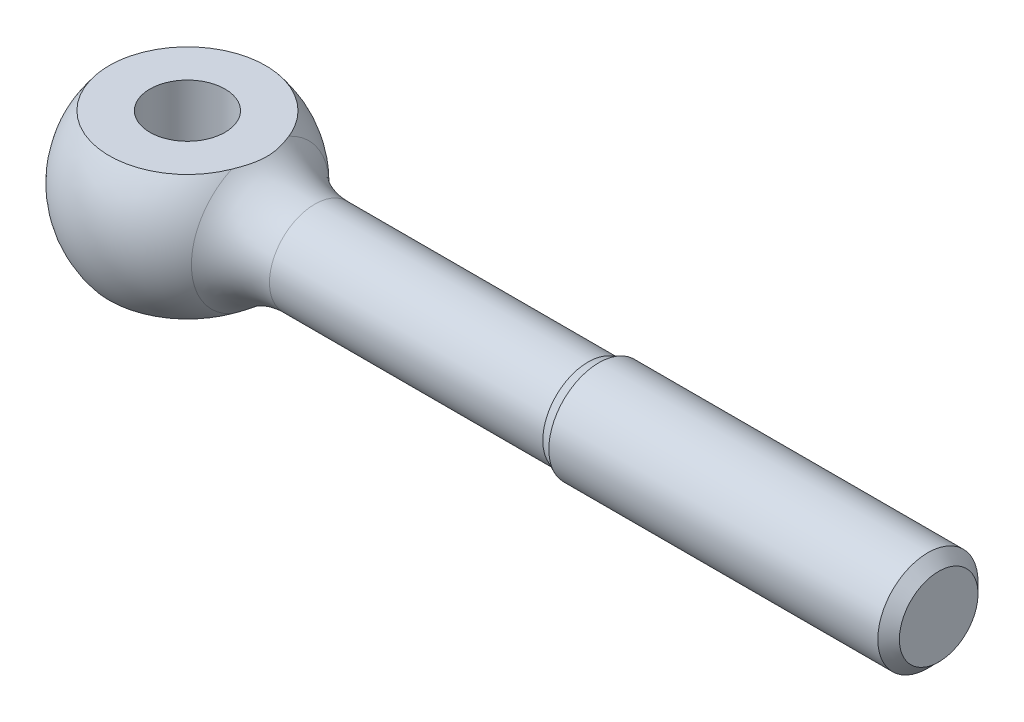
ISO-10303-21;
HEADER;
FILE_DESCRIPTION(('STEP AP214'),'2;1');
FILE_NAME('part.step','',(''),(''),'','','');
FILE_SCHEMA(('AUTOMOTIVE_DESIGN { 1 0 10303 214 1 1 1 1 }'));
ENDSEC;
DATA;
#1=APPLICATION_CONTEXT('core data for automotive mechanical design processes');
#2=APPLICATION_PROTOCOL_DEFINITION('international standard','automotive_design',2000,#1);
#3=PRODUCT_CONTEXT('',#1,'mechanical');
#4=PRODUCT('Part','Part','',(#3));
#5=PRODUCT_RELATED_PRODUCT_CATEGORY('part','',(#4));
#6=PRODUCT_DEFINITION_FORMATION('','',#4);
#7=PRODUCT_DEFINITION_CONTEXT('part definition',#1,'design');
#8=PRODUCT_DEFINITION('design','',#6,#7);
#9=PRODUCT_DEFINITION_SHAPE('','',#8);
#10=(LENGTH_UNIT() NAMED_UNIT(*) SI_UNIT(.MILLI.,.METRE.));
#11=(NAMED_UNIT(*) PLANE_ANGLE_UNIT() SI_UNIT($,.RADIAN.));
#12=(NAMED_UNIT(*) SI_UNIT($,.STERADIAN.) SOLID_ANGLE_UNIT());
#13=UNCERTAINTY_MEASURE_WITH_UNIT(LENGTH_MEASURE(1.E-05),#10,'distance_accuracy_value','');
#14=(GEOMETRIC_REPRESENTATION_CONTEXT(3) GLOBAL_UNCERTAINTY_ASSIGNED_CONTEXT((#13)) GLOBAL_UNIT_ASSIGNED_CONTEXT((#10,
#11,#12)) REPRESENTATION_CONTEXT('',''));
#15=CARTESIAN_POINT('',(0.,0.,0.));
#16=DIRECTION('',(0.,0.,1.));
#17=DIRECTION('',(1.,0.,0.));
#18=AXIS2_PLACEMENT_3D('',#15,#16,#17);
#19=CARTESIAN_POINT('',(-16.430415,32.7845575287547,0.));
#20=DIRECTION('',(0.,-1.,0.));
#21=DIRECTION('',(0.,0.,-1.));
#22=AXIS2_PLACEMENT_3D('',#19,#20,#21);
#23=CYLINDRICAL_SURFACE('',#22,1.5);
#24=CARTESIAN_POINT('',(-16.430415,2.50000000000001,0.));
#25=DIRECTION('',(0.,-1.,0.));
#26=DIRECTION('',(0.,0.,-1.));
#27=AXIS2_PLACEMENT_3D('',#24,#25,#26);
#28=CIRCLE('',#27,1.5);
#29=CARTESIAN_POINT('',(-16.430415,2.50000000000001,-1.5));
#30=VERTEX_POINT('',#29);
#31=EDGE_CURVE('E62',#30,#30,#28,.F.);
#32=ORIENTED_EDGE('',*,*,#31,.T.);
#33=EDGE_LOOP('',(#32));
#34=FACE_BOUND('',#33,.T.);
#35=CARTESIAN_POINT('',(-16.430415,-2.49999999999999,0.));
#36=DIRECTION('',(0.,-1.,0.));
#37=DIRECTION('',(0.,0.,-1.));
#38=AXIS2_PLACEMENT_3D('',#35,#36,#37);
#39=CIRCLE('',#38,1.5);
#40=CARTESIAN_POINT('',(-16.430415,-2.49999999999999,-1.5));
#41=VERTEX_POINT('',#40);
#42=EDGE_CURVE('E211',#41,#41,#39,.T.);
#43=ORIENTED_EDGE('',*,*,#42,.T.);
#44=EDGE_LOOP('',(#43));
#45=FACE_BOUND('',#44,.T.);
#46=ADVANCED_FACE('F17',(#34,#45),#23,.F.);
#47=CARTESIAN_POINT('',(-12.430415,-2.49999999999999,-3.1224989991992));
#48=DIRECTION('',(0.,1.,0.));
#49=DIRECTION('',(0.,0.,1.));
#50=AXIS2_PLACEMENT_3D('',#47,#48,#49);
#51=PLANE('',#50);
#52=ORIENTED_EDGE('',*,*,#42,.F.);
#53=EDGE_LOOP('',(#52));
#54=FACE_BOUND('',#53,.T.);
#55=CARTESIAN_POINT('',(-13.524595940223,-2.49999999999999,-1.1428978921307));
#56=CARTESIAN_POINT('',(-13.5567368660586,-2.49999999999999,-1.22463926203189));
#57=CARTESIAN_POINT('',(-13.5923408409082,-2.49999999999999,-1.30501429838637));
#58=CARTESIAN_POINT('',(-13.6701871202625,-2.49999999999999,-1.46247812074654));
#59=CARTESIAN_POINT('',(-13.7124291118369,-2.49999999999999,-1.5395670614482));
#60=CARTESIAN_POINT('',(-13.8032241577669,-2.49999999999999,-1.6898424399874));
#61=CARTESIAN_POINT('',(-13.8517712581273,-2.49999999999999,-1.76303246881264));
#62=CARTESIAN_POINT('',(-13.9548352861876,-2.49999999999999,-1.90504949057192));
#63=CARTESIAN_POINT('',(-14.009352131782,-2.49999999999999,-1.97387654349199));
#64=CARTESIAN_POINT('',(-14.1813573101929,-2.49999999999999,-2.17312248058257));
#65=CARTESIAN_POINT('',(-14.3073456944323,-2.49999999999999,-2.29638114868705));
#66=CARTESIAN_POINT('',(-14.5781922836227,-2.49999999999999,-2.51995079134315));
#67=CARTESIAN_POINT('',(-14.7230540827756,-2.49999999999999,-2.62025738490982));
#68=CARTESIAN_POINT('',(-15.0276458685913,-2.49999999999999,-2.79519191197083));
#69=CARTESIAN_POINT('',(-15.1873843121425,-2.5,-2.86980512501155));
#70=CARTESIAN_POINT('',(-15.5169829326932,-2.49999999999998,-2.99105390113957));
#71=CARTESIAN_POINT('',(-15.6868293243354,-2.49999999999995,-3.03772665021387));
#72=CARTESIAN_POINT('',(-15.953384925106,-2.49999999999997,-3.08733559515243));
#73=CARTESIAN_POINT('',(-16.0482991702281,-2.49999999999998,-3.1005080376549));
#74=CARTESIAN_POINT('',(-16.2389319447034,-2.5,-3.11809183040555));
#75=CARTESIAN_POINT('',(-16.3346504429088,-2.49999999999999,-3.12250351839184));
#76=CARTESIAN_POINT('',(-16.6057683715715,-2.49999999999999,-3.12249072415791));
#77=CARTESIAN_POINT('',(-16.7812761732812,-2.49999999999999,-3.10767541517859));
#78=CARTESIAN_POINT('',(-17.1274906802518,-2.49999999999999,-3.04877068055413));
#79=CARTESIAN_POINT('',(-17.2981899692712,-2.49999999999998,-3.00463836737204));
#80=CARTESIAN_POINT('',(-17.629673558849,-2.49999999999998,-2.8883551353376));
#81=CARTESIAN_POINT('',(-17.7904635272921,-2.49999999999999,-2.81622040879443));
#82=CARTESIAN_POINT('',(-18.0975948561608,-2.49999999999999,-2.64600334290594));
#83=CARTESIAN_POINT('',(-18.243940671218,-2.49999999999999,-2.54792903797721));
#84=CARTESIAN_POINT('',(-18.5181123873996,-2.49999999999998,-2.32859212437852));
#85=CARTESIAN_POINT('',(-18.6459358953709,-2.49999999999999,-2.20732652399153));
#86=CARTESIAN_POINT('',(-18.8794160536925,-2.49999999999999,-1.94505050451286));
#87=CARTESIAN_POINT('',(-18.9850715668696,-2.49999999999999,-1.80403907311862));
#88=CARTESIAN_POINT('',(-19.1712063819853,-2.49999999999999,-1.50628281772447));
#89=CARTESIAN_POINT('',(-19.2516862827807,-2.49999999999999,-1.34953836808591));
#90=CARTESIAN_POINT('',(-19.3851883129915,-2.49999999999999,-1.02476338772591));
#91=CARTESIAN_POINT('',(-19.4382105441341,-2.49999999999999,-0.856732898820413));
#92=CARTESIAN_POINT('',(-19.5152926899075,-2.49999999999999,-0.514154719911592));
#93=CARTESIAN_POINT('',(-19.5393525236232,-2.49999999999999,-0.339607011701875));
#94=CARTESIAN_POINT('',(-19.5578265879258,-2.49999999999999,0.0110499255171217));
#95=CARTESIAN_POINT('',(-19.5522408743253,-2.49999999999999,0.187159151585962));
#96=CARTESIAN_POINT('',(-19.5115825347528,-2.49999999999999,0.535940265461711));
#97=CARTESIAN_POINT('',(-19.4765099039244,-2.49999999999999,0.708612152702497));
#98=CARTESIAN_POINT('',(-19.3778732527818,-2.49999999999999,1.04561718171691));
#99=CARTESIAN_POINT('',(-19.3143091882126,-2.49999999999999,1.20995031053776));
#100=CARTESIAN_POINT('',(-19.1604940410886,-2.49999999999999,1.52561262617009));
#101=CARTESIAN_POINT('',(-19.0702429528602,-2.5,1.67694181021703));
#102=CARTESIAN_POINT('',(-18.8656159346688,-2.49999999999999,1.96230011506724));
#103=CARTESIAN_POINT('',(-18.7512400524363,-2.49999999999997,2.0963292700974));
#104=CARTESIAN_POINT('',(-18.5016103536625,-2.50000000000001,2.34328295986282));
#105=CARTESIAN_POINT('',(-18.3663565746603,-2.50000000000006,2.45620753254402));
#106=CARTESIAN_POINT('',(-18.078809563764,-2.49999999999992,2.65774734081834));
#107=CARTESIAN_POINT('',(-17.9265162368875,-2.49999999999974,2.74636244089557));
#108=CARTESIAN_POINT('',(-17.6092130015527,-2.49999999999974,2.89676737013976));
#109=CARTESIAN_POINT('',(-17.4442030193099,-2.49999999999993,2.9585570436468));
#110=CARTESIAN_POINT('',(-17.1061543897262,-2.50000000000005,3.05355549140488));
#111=CARTESIAN_POINT('',(-16.9331158803634,-2.49999999999999,3.08676475664652));
#112=CARTESIAN_POINT('',(-16.5839219982289,-2.49999999999996,3.1236612529022));
#113=CARTESIAN_POINT('',(-16.4077666691203,-2.49999999999998,3.12734889715296));
#114=CARTESIAN_POINT('',(-16.0573291073801,-2.5,3.10509800790834));
#115=CARTESIAN_POINT('',(-15.8830469597271,-2.49999999999999,3.0791581360097));
#116=CARTESIAN_POINT('',(-15.5413086394673,-2.49999999999998,2.99838588241138));
#117=CARTESIAN_POINT('',(-15.373852583804,-2.49999999999999,2.94355300594586));
#118=CARTESIAN_POINT('',(-15.050536008266,-2.49999999999999,2.80655597267397));
#119=CARTESIAN_POINT('',(-14.8946745685072,-2.49999999999998,2.72439398691786));
#120=CARTESIAN_POINT('',(-14.5989472876592,-2.49999999999999,2.53506504576685));
#121=CARTESIAN_POINT('',(-14.4590826397929,-2.5,2.42789622688757));
#122=CARTESIAN_POINT('',(-14.1993354219764,-2.49999999999999,2.19159875654685));
#123=CARTESIAN_POINT('',(-14.0794514609099,-2.49999999999997,2.06247163515502));
#124=CARTESIAN_POINT('',(-13.8784652941468,-2.49999999999997,1.80561116952173));
#125=CARTESIAN_POINT('',(-13.7942724901493,-2.49999999999999,1.68029059166461));
#126=CARTESIAN_POINT('',(-13.6822358743962,-2.49999999999999,1.48431331758132));
#127=CARTESIAN_POINT('',(-13.6472637072771,-2.49999999999999,1.41764959643221));
#128=CARTESIAN_POINT('',(-13.5822172842706,-2.49999999999999,1.28196303245504));
#129=CARTESIAN_POINT('',(-13.5521436806339,-2.49999999999999,1.21293987694294));
#130=CARTESIAN_POINT('',(-13.524595940223,-2.49999999999999,1.1428978921307));
#131=B_SPLINE_CURVE_WITH_KNOTS('',3,(#55,#56,#57,#58,#59,#60,#61,#62,#63,#64,#65,#66,#67,#68,
#69,#70,#71,#72,#73,#74,#75,#76,#77,#78,#79,#80,#81,#82,#83,#84,#85,#86,#87,#88,#89,#90,#91,#92,
#93,#94,#95,#96,#97,#98,#99,#100,#101,#102,#103,#104,#105,#106,#107,#108,#109,#110,#111,#112,
#113,#114,#115,#116,#117,#118,#119,#120,#121,#122,#123,#124,#125,#126,#127,#128,#129,#130),
.UNSPECIFIED.,.F.,.F.,(4,2,2,2,2,2,2,2,2,2,2,2,2,2,2,2,2,2,2,2,2,2,2,2,2,2,2,2,2,2,2,2,2,2,2,2,
2,4),(0.,0.263414259689397,0.526816105185968,0.789971001274575,1.05312227849276,
1.57916510543364,2.10530825737322,2.63175235180025,3.15749423461266,3.44460646530042,
3.73170762723536,4.25741524032911,4.78389360413193,5.31006798583657,5.8360795829562,
6.36215908230531,6.888265561868,7.41435952588778,7.94045154078226,8.46654502546847,
8.99263751969653,9.51873010057026,10.0448234986108,10.5709170084954,11.0970094775251,
11.6231010006337,12.1491954564391,12.6752929649725,13.2013814353533,13.7274625416582,
14.2535674142657,14.7796812962228,15.305753393174,15.8318647050223,16.3579393720838,
16.8092076713177,17.034875219021,17.2605727901528),.UNSPECIFIED.);
#132=CARTESIAN_POINT('',(-13.524595940223,-2.49999999999999,-1.14289789213067));
#133=VERTEX_POINT('',#132);
#134=CARTESIAN_POINT('',(-13.524595940223,-2.49999999999999,1.14289789213069));
#135=VERTEX_POINT('',#134);
#136=EDGE_CURVE('E55',#133,#135,#131,.T.);
#137=ORIENTED_EDGE('',*,*,#136,.F.);
#138=CARTESIAN_POINT('',(-13.524595940223,-2.49999999999999,-1.14289789213068));
#139=CARTESIAN_POINT('',(-13.499200790924,-2.49999999999999,-1.07825053070375));
#140=CARTESIAN_POINT('',(-13.4744664858845,-2.49999999999999,-1.01329951319512));
#141=CARTESIAN_POINT('',(-13.4271247212185,-2.49999999999999,-0.881760918662736));
#142=CARTESIAN_POINT('',(-13.4045460492588,-2.49999999999999,-0.815163065115482));
#143=CARTESIAN_POINT('',(-13.3629010862458,-2.49999999999999,-0.680581259809072));
#144=CARTESIAN_POINT('',(-13.3438479362499,-2.49999999999999,-0.612593131133472));
#145=CARTESIAN_POINT('',(-13.3115670485199,-2.49999999999999,-0.478962020680978));
#146=CARTESIAN_POINT('',(-13.2980877030017,-2.49999999999999,-0.413381184760442));
#147=CARTESIAN_POINT('',(-13.2767364786791,-2.49999999999999,-0.281567599060676));
#148=CARTESIAN_POINT('',(-13.2688414238244,-2.49999999999999,-0.21533871409973));
#149=CARTESIAN_POINT('',(-13.2593638888557,-2.49999999999999,-0.0826316351900437));
#150=CARTESIAN_POINT('',(-13.2577609382026,-2.49999999999999,-0.0161549551731257));
#151=CARTESIAN_POINT('',(-13.2608491277909,-2.49999999999999,0.111348957452643));
#152=CARTESIAN_POINT('',(-13.2650496169922,-2.49999999999999,0.172388930874359));
#153=CARTESIAN_POINT('',(-13.278536344856,-2.49999999999999,0.294083249894014));
#154=CARTESIAN_POINT('',(-13.2878383640093,-2.49999999999999,0.354735805133442));
#155=CARTESIAN_POINT('',(-13.3108517063395,-2.49999999999999,0.475401330990348));
#156=CARTESIAN_POINT('',(-13.3245785617971,-2.49999999999999,0.535411267575846));
#157=CARTESIAN_POINT('',(-13.3563351620112,-2.49999999999999,0.657531680185444));
#158=CARTESIAN_POINT('',(-13.3745483542819,-2.49999999999999,0.71959360743062));
#159=CARTESIAN_POINT('',(-13.4137702392131,-2.49999999999999,0.842570730772874));
#160=CARTESIAN_POINT('',(-13.434769029535,-2.49999999999999,0.903489154491351));
#161=CARTESIAN_POINT('',(-13.4785355386727,-2.49999999999999,1.02398349010867));
#162=CARTESIAN_POINT('',(-13.5012828477354,-2.49999999999999,1.08356676551448));
#163=CARTESIAN_POINT('',(-13.524595940223,-2.49999999999999,1.14289789213068));
#164=B_SPLINE_CURVE_WITH_KNOTS('',3,(#138,#139,#140,#141,#142,#143,#144,#145,#146,#147,#148,
#149,#150,#151,#152,#153,#154,#155,#156,#157,#158,#159,#160,#161,#162,#163),.UNSPECIFIED.,.F.,
.F.,(4,2,2,2,2,2,2,2,2,2,2,2,4),(0.,0.208429010934663,0.419336452697772,0.631014857291546,
0.83167463411297,1.03149666256139,1.23066805467507,1.413992067586,1.59788637896195,
1.78243336611685,1.97637342164557,2.16964165687939,2.3609225633829),.UNSPECIFIED.);
#165=EDGE_CURVE('E49',#133,#135,#164,.T.);
#166=ORIENTED_EDGE('',*,*,#165,.T.);
#167=EDGE_LOOP('',(#137,#166));
#168=FACE_BOUND('',#167,.T.);
#169=ADVANCED_FACE('F54',(#54,#168),#51,.F.);
#170=CARTESIAN_POINT('',(-12.430415,2.50000000000001,3.1224989991992));
#171=DIRECTION('',(0.,-1.,0.));
#172=DIRECTION('',(0.,0.,-1.));
#173=AXIS2_PLACEMENT_3D('',#170,#171,#172);
#174=PLANE('',#173);
#175=ORIENTED_EDGE('',*,*,#31,.F.);
#176=EDGE_LOOP('',(#175));
#177=FACE_BOUND('',#176,.T.);
#178=CARTESIAN_POINT('',(-13.524595940223,2.50000000000001,1.14289789213065));
#179=CARTESIAN_POINT('',(-13.5567368660586,2.50000000000001,1.22463926203184));
#180=CARTESIAN_POINT('',(-13.5923408409082,2.50000000000001,1.30501429838632));
#181=CARTESIAN_POINT('',(-13.6701871202625,2.50000000000001,1.46247812074649));
#182=CARTESIAN_POINT('',(-13.7124291118369,2.50000000000001,1.53956706144815));
#183=CARTESIAN_POINT('',(-13.8032241577668,2.50000000000001,1.68984243998735));
#184=CARTESIAN_POINT('',(-13.8517712581273,2.50000000000001,1.76303246881259));
#185=CARTESIAN_POINT('',(-13.9548352861876,2.50000000000001,1.90504949057187));
#186=CARTESIAN_POINT('',(-14.009352131782,2.50000000000001,1.97387654349194));
#187=CARTESIAN_POINT('',(-14.1813573101929,2.50000000000001,2.17312248058253));
#188=CARTESIAN_POINT('',(-14.3073456944323,2.50000000000001,2.296381148687));
#189=CARTESIAN_POINT('',(-14.5781922836227,2.50000000000001,2.51995079134311));
#190=CARTESIAN_POINT('',(-14.7230540827756,2.50000000000001,2.62025738490978));
#191=CARTESIAN_POINT('',(-15.0276458685913,2.50000000000001,2.7951919119708));
#192=CARTESIAN_POINT('',(-15.1873843121424,2.50000000000002,2.86980512501152));
#193=CARTESIAN_POINT('',(-15.5169829326932,2.5,2.99105390113954));
#194=CARTESIAN_POINT('',(-15.6868293243354,2.49999999999997,3.03772665021384));
#195=CARTESIAN_POINT('',(-15.953384925106,2.49999999999999,3.0873355951524));
#196=CARTESIAN_POINT('',(-16.048299170228,2.5,3.10050803765488));
#197=CARTESIAN_POINT('',(-16.2389319447034,2.50000000000002,3.11809183040553));
#198=CARTESIAN_POINT('',(-16.3346504429088,2.50000000000001,3.12250351839182));
#199=CARTESIAN_POINT('',(-16.6057683715715,2.50000000000001,3.12249072415789));
#200=CARTESIAN_POINT('',(-16.7812761732812,2.50000000000001,3.10767541517858));
#201=CARTESIAN_POINT('',(-17.1274906802518,2.50000000000001,3.04877068055411));
#202=CARTESIAN_POINT('',(-17.2981899692712,2.5,3.00463836737202));
#203=CARTESIAN_POINT('',(-17.629673558849,2.5,2.88835513533758));
#204=CARTESIAN_POINT('',(-17.7904635272921,2.50000000000001,2.81622040879441));
#205=CARTESIAN_POINT('',(-18.0975948561607,2.50000000000001,2.64600334290593));
#206=CARTESIAN_POINT('',(-18.243940671218,2.50000000000001,2.5479290379772));
#207=CARTESIAN_POINT('',(-18.5181123873996,2.50000000000001,2.32859212437851));
#208=CARTESIAN_POINT('',(-18.6459358953709,2.50000000000001,2.20732652399151));
#209=CARTESIAN_POINT('',(-18.8794160536924,2.50000000000001,1.94505050451285));
#210=CARTESIAN_POINT('',(-18.9850715668696,2.50000000000001,1.80403907311861));
#211=CARTESIAN_POINT('',(-19.1712063819852,2.50000000000001,1.50628281772446));
#212=CARTESIAN_POINT('',(-19.2516862827807,2.50000000000001,1.3495383680859));
#213=CARTESIAN_POINT('',(-19.3851883129915,2.50000000000001,1.0247633877259));
#214=CARTESIAN_POINT('',(-19.4382105441341,2.50000000000001,0.856732898820406));
#215=CARTESIAN_POINT('',(-19.5152926899075,2.50000000000001,0.514154719911587));
#216=CARTESIAN_POINT('',(-19.5393525236232,2.50000000000001,0.339607011701872));
#217=CARTESIAN_POINT('',(-19.5578265879257,2.50000000000001,-0.0110499255171235));
#218=CARTESIAN_POINT('',(-19.5522408743252,2.50000000000001,-0.187159151585963));
#219=CARTESIAN_POINT('',(-19.5115825347528,2.50000000000001,-0.53594026546171));
#220=CARTESIAN_POINT('',(-19.4765099039244,2.50000000000001,-0.708612152702496));
#221=CARTESIAN_POINT('',(-19.3778732527818,2.50000000000001,-1.04561718171691));
#222=CARTESIAN_POINT('',(-19.3143091882126,2.50000000000001,-1.20995031053775));
#223=CARTESIAN_POINT('',(-19.1604940410885,2.50000000000001,-1.52561262617008));
#224=CARTESIAN_POINT('',(-19.0702429528601,2.50000000000002,-1.67694181021702));
#225=CARTESIAN_POINT('',(-18.8656159346688,2.50000000000001,-1.96230011506723));
#226=CARTESIAN_POINT('',(-18.7512400524363,2.49999999999999,-2.09632927009739));
#227=CARTESIAN_POINT('',(-18.5016103536625,2.50000000000003,-2.34328295986281));
#228=CARTESIAN_POINT('',(-18.3663565746603,2.50000000000008,-2.456207532544));
#229=CARTESIAN_POINT('',(-18.078809563764,2.49999999999995,-2.65774734081832));
#230=CARTESIAN_POINT('',(-17.9265162368875,2.49999999999977,-2.74636244089555));
#231=CARTESIAN_POINT('',(-17.6092130015527,2.49999999999977,-2.89676737013974));
#232=CARTESIAN_POINT('',(-17.4442030193099,2.49999999999995,-2.95855704364678));
#233=CARTESIAN_POINT('',(-17.1061543897262,2.50000000000007,-3.05355549140486));
#234=CARTESIAN_POINT('',(-16.9331158803634,2.50000000000001,-3.0867647566465));
#235=CARTESIAN_POINT('',(-16.5839219982289,2.49999999999998,-3.12366125290218));
#236=CARTESIAN_POINT('',(-16.4077666691203,2.5,-3.12734889715294));
#237=CARTESIAN_POINT('',(-16.0573291073801,2.50000000000002,-3.10509800790832));
#238=CARTESIAN_POINT('',(-15.8830469597271,2.50000000000001,-3.07915813600968));
#239=CARTESIAN_POINT('',(-15.5413086394673,2.5,-2.99838588241136));
#240=CARTESIAN_POINT('',(-15.373852583804,2.50000000000001,-2.94355300594584));
#241=CARTESIAN_POINT('',(-15.050536008266,2.50000000000001,-2.80655597267395));
#242=CARTESIAN_POINT('',(-14.8946745685072,2.5,-2.72439398691784));
#243=CARTESIAN_POINT('',(-14.5989472876592,2.50000000000001,-2.53506504576683));
#244=CARTESIAN_POINT('',(-14.459082639793,2.50000000000001,-2.42789622688755));
#245=CARTESIAN_POINT('',(-14.1993354219764,2.50000000000001,-2.19159875654684));
#246=CARTESIAN_POINT('',(-14.0794514609099,2.49999999999999,-2.06247163515501));
#247=CARTESIAN_POINT('',(-13.8784652941468,2.49999999999999,-1.80561116952171));
#248=CARTESIAN_POINT('',(-13.7942724901493,2.50000000000001,-1.68029059166458));
#249=CARTESIAN_POINT('',(-13.6822358743962,2.50000000000001,-1.48431331758128));
#250=CARTESIAN_POINT('',(-13.6472637072771,2.50000000000001,-1.41764959643218));
#251=CARTESIAN_POINT('',(-13.5822172842706,2.50000000000001,-1.281963032455));
#252=CARTESIAN_POINT('',(-13.5521436806339,2.50000000000001,-1.21293987694289));
#253=CARTESIAN_POINT('',(-13.524595940223,2.50000000000001,-1.14289789213065));
#254=B_SPLINE_CURVE_WITH_KNOTS('',3,(#178,#179,#180,#181,#182,#183,#184,#185,#186,#187,#188,
#189,#190,#191,#192,#193,#194,#195,#196,#197,#198,#199,#200,#201,#202,#203,#204,#205,#206,#207,
#208,#209,#210,#211,#212,#213,#214,#215,#216,#217,#218,#219,#220,#221,#222,#223,#224,#225,#226,
#227,#228,#229,#230,#231,#232,#233,#234,#235,#236,#237,#238,#239,#240,#241,#242,#243,#244,#245,
#246,#247,#248,#249,#250,#251,#252,#253),.UNSPECIFIED.,.F.,.F.,(4,2,2,2,2,2,2,2,2,2,2,2,2,2,2,2,
2,2,2,2,2,2,2,2,2,2,2,2,2,2,2,2,2,2,2,2,2,4),(0.,0.263414259689396,0.526816105185966,
0.789971001274571,1.05312227849275,1.57916510543363,2.10530825737321,2.63175235180024,
3.15749423461265,3.44460646530042,3.73170762723538,4.25741524032913,4.78389360413194,
5.31006798583658,5.83607958295621,6.36215908230532,6.888265561868,7.41435952588778,
7.94045154078225,8.46654502546846,8.99263751969652,9.51873010057025,10.0448234986108,
10.5709170084954,11.097009477525,11.6231010006336,12.1491954564391,12.6752929649725,
13.2013814353533,13.7274625416582,14.2535674142656,14.7796812962228,15.305753393174,
15.8318647050223,16.3579393720837,16.8092076713177,17.034875219021,17.2605727901528),.UNSPECIFIED.);
#255=CARTESIAN_POINT('',(-13.524595940223,2.50000000000001,1.14289789213062));
#256=VERTEX_POINT('',#255);
#257=CARTESIAN_POINT('',(-13.524595940223,2.50000000000001,-1.14289789213064));
#258=VERTEX_POINT('',#257);
#259=EDGE_CURVE('E60',#256,#258,#254,.T.);
#260=ORIENTED_EDGE('',*,*,#259,.F.);
#261=CARTESIAN_POINT('',(-13.524595940223,2.50000000000001,1.14289789213063));
#262=CARTESIAN_POINT('',(-13.499200790924,2.50000000000001,1.07825053070371));
#263=CARTESIAN_POINT('',(-13.4744664858845,2.50000000000001,1.01329951319508));
#264=CARTESIAN_POINT('',(-13.4271247212185,2.50000000000001,0.881760918662701));
#265=CARTESIAN_POINT('',(-13.4045460492588,2.50000000000001,0.815163065115451));
#266=CARTESIAN_POINT('',(-13.3629010862458,2.50000000000001,0.680581259809049));
#267=CARTESIAN_POINT('',(-13.34384793625,2.50000000000001,0.612593131133453));
#268=CARTESIAN_POINT('',(-13.31156704852,2.50000000000001,0.478962020680966));
#269=CARTESIAN_POINT('',(-13.2980877030017,2.50000000000001,0.413381184760433));
#270=CARTESIAN_POINT('',(-13.2767364786792,2.50000000000001,0.281567599060674));
#271=CARTESIAN_POINT('',(-13.2688414238244,2.50000000000001,0.215338714099732));
#272=CARTESIAN_POINT('',(-13.2593638888557,2.50000000000001,0.082631635190054));
#273=CARTESIAN_POINT('',(-13.2577609382026,2.50000000000001,0.0161549551731398));
#274=CARTESIAN_POINT('',(-13.260849127791,2.50000000000001,-0.111348957452624));
#275=CARTESIAN_POINT('',(-13.2650496169922,2.50000000000001,-0.172388930874337));
#276=CARTESIAN_POINT('',(-13.278536344856,2.50000000000001,-0.294083249893989));
#277=CARTESIAN_POINT('',(-13.2878383640093,2.50000000000001,-0.354735805133415));
#278=CARTESIAN_POINT('',(-13.3108517063395,2.50000000000001,-0.475401330990318));
#279=CARTESIAN_POINT('',(-13.3245785617971,2.50000000000001,-0.535411267575814));
#280=CARTESIAN_POINT('',(-13.3563351620113,2.50000000000001,-0.657531680185408));
#281=CARTESIAN_POINT('',(-13.3745483542819,2.50000000000001,-0.719593607430581));
#282=CARTESIAN_POINT('',(-13.4137702392131,2.50000000000001,-0.842570730772832));
#283=CARTESIAN_POINT('',(-13.434769029535,2.50000000000001,-0.903489154491308));
#284=CARTESIAN_POINT('',(-13.4785355386727,2.50000000000001,-1.02398349010862));
#285=CARTESIAN_POINT('',(-13.5012828477354,2.50000000000001,-1.08356676551443));
#286=CARTESIAN_POINT('',(-13.524595940223,2.50000000000001,-1.14289789213063));
#287=B_SPLINE_CURVE_WITH_KNOTS('',3,(#261,#262,#263,#264,#265,#266,#267,#268,#269,#270,#271,
#272,#273,#274,#275,#276,#277,#278,#279,#280,#281,#282,#283,#284,#285,#286),.UNSPECIFIED.,.F.,
.F.,(4,2,2,2,2,2,2,2,2,2,2,2,4),(0.,0.20842901093465,0.419336452697746,0.631014857291507,
0.83167463411292,1.03149666256132,1.23066805467499,1.41399206758592,1.59788637896186,
1.78243336611676,1.97637342164547,2.16964165687929,2.36092256338279),.UNSPECIFIED.);
#288=EDGE_CURVE('E34',#256,#258,#287,.T.);
#289=ORIENTED_EDGE('',*,*,#288,.T.);
#290=EDGE_LOOP('',(#260,#289));
#291=FACE_BOUND('',#290,.T.);
#292=ADVANCED_FACE('F82',(#177,#291),#174,.F.);
#293=CARTESIAN_POINT('',(-16.430415,0.,0.));
#294=DIRECTION('',(1.,0.,0.));
#295=DIRECTION('',(0.,1.,0.));
#296=AXIS2_PLACEMENT_3D('',#293,#294,#295);
#297=SPHERICAL_SURFACE('',#296,4.);
#298=CARTESIAN_POINT('',(-20.430415,0.,0.));
#299=VERTEX_POINT('',#298);
#300=VERTEX_LOOP('',#299);
#301=FACE_BOUND('',#300,.T.);
#302=ORIENTED_EDGE('',*,*,#136,.T.);
#303=CARTESIAN_POINT('',(-13.524595940223,0.,0.));
#304=DIRECTION('',(1.,0.,0.));
#305=DIRECTION('',(0.,0.,-1.));
#306=AXIS2_PLACEMENT_3D('',#303,#304,#305);
#307=CIRCLE('',#306,2.74885714285712);
#308=EDGE_CURVE('E45',#135,#256,#307,.F.);
#309=ORIENTED_EDGE('',*,*,#308,.T.);
#310=ORIENTED_EDGE('',*,*,#259,.T.);
#311=CARTESIAN_POINT('',(-13.524595940223,0.,0.));
#312=DIRECTION('',(1.,0.,0.));
#313=DIRECTION('',(0.,0.,-1.));
#314=AXIS2_PLACEMENT_3D('',#311,#312,#313);
#315=CIRCLE('',#314,2.74885714285712);
#316=EDGE_CURVE('E59',#258,#133,#315,.F.);
#317=ORIENTED_EDGE('',*,*,#316,.T.);
#318=EDGE_LOOP('',(#302,#309,#310,#317));
#319=FACE_BOUND('',#318,.T.);
#320=ADVANCED_FACE('F58',(#301,#319),#297,.T.);
#321=CARTESIAN_POINT('',(-11.3452316453903,0.,0.));
#322=DIRECTION('',(1.,0.,0.));
#323=DIRECTION('',(0.,0.,-1.));
#324=AXIS2_PLACEMENT_3D('',#321,#322,#323);
#325=TOROIDAL_SURFACE('',#324,4.8105,3.);
#326=CARTESIAN_POINT('',(-11.3452316453903,0.,0.));
#327=DIRECTION('',(1.,0.,0.));
#328=DIRECTION('',(0.,1.,0.));
#329=AXIS2_PLACEMENT_3D('',#326,#327,#328);
#330=CIRCLE('',#329,1.8105);
#331=CARTESIAN_POINT('',(-11.3452316453903,1.8105,0.));
#332=VERTEX_POINT('',#331);
#333=EDGE_CURVE('E95',#332,#332,#330,.T.);
#334=ORIENTED_EDGE('',*,*,#333,.F.);
#335=EDGE_LOOP('',(#334));
#336=FACE_BOUND('',#335,.T.);
#337=ORIENTED_EDGE('',*,*,#288,.F.);
#338=ORIENTED_EDGE('',*,*,#308,.F.);
#339=ORIENTED_EDGE('',*,*,#165,.F.);
#340=ORIENTED_EDGE('',*,*,#316,.F.);
#341=EDGE_LOOP('',(#337,#338,#339,#340));
#342=FACE_BOUND('',#341,.T.);
#343=ADVANCED_FACE('F47',(#336,#342),#325,.F.);
#344=CARTESIAN_POINT('',(13.569585,1.,0.));
#345=DIRECTION('',(1.,0.,0.));
#346=DIRECTION('',(0.,1.,0.));
#347=AXIS2_PLACEMENT_3D('',#344,#345,#346);
#348=PLANE('',#347);
#349=CARTESIAN_POINT('',(13.5695850000275,0.,0.));
#350=DIRECTION('',(-1.,0.,0.));
#351=DIRECTION('',(0.,0.,1.));
#352=AXIS2_PLACEMENT_3D('',#349,#350,#351);
#353=CIRCLE('',#352,1.56958500002702);
#354=CARTESIAN_POINT('',(13.5695850000275,0.,1.56958500002702));
#355=VERTEX_POINT('',#354);
#356=EDGE_CURVE('E92',#355,#355,#353,.T.);
#357=ORIENTED_EDGE('',*,*,#356,.F.);
#358=EDGE_LOOP('',(#357));
#359=FACE_BOUND('',#358,.T.);
#360=ADVANCED_FACE('F123',(#359),#348,.T.);
#361=CARTESIAN_POINT('',(-6.6470130718021,0.,0.));
#362=DIRECTION('',(1.,0.,0.));
#363=DIRECTION('',(0.,1.,0.));
#364=AXIS2_PLACEMENT_3D('',#361,#362,#363);
#365=CYLINDRICAL_SURFACE('',#364,1.8105);
#366=ORIENTED_EDGE('',*,*,#333,.T.);
#367=EDGE_LOOP('',(#366));
#368=FACE_BOUND('',#367,.T.);
#369=CARTESIAN_POINT('',(-0.430414999925688,0.,0.));
#370=DIRECTION('',(1.,0.,0.));
#371=DIRECTION('',(0.,1.,0.));
#372=AXIS2_PLACEMENT_3D('',#369,#370,#371);
#373=CIRCLE('',#372,1.81050000003324);
#374=CARTESIAN_POINT('',(-0.430414999925688,1.81050000003324,0.));
#375=VERTEX_POINT('',#374);
#376=EDGE_CURVE('E94',#375,#375,#373,.T.);
#377=ORIENTED_EDGE('',*,*,#376,.F.);
#378=EDGE_LOOP('',(#377));
#379=FACE_BOUND('',#378,.T.);
#380=ADVANCED_FACE('F119',(#368,#379),#365,.T.);
#381=CARTESIAN_POINT('',(13.1391699999881,0.,0.));
#382=DIRECTION('',(-1.,0.,0.));
#383=DIRECTION('',(0.,0.,1.));
#384=AXIS2_PLACEMENT_3D('',#381,#382,#383);
#385=CONICAL_SURFACE('',#384,2.0000000000664,0.785398163397449);
#386=CARTESIAN_POINT('',(13.13917,0.,0.));
#387=DIRECTION('',(1.,0.,0.));
#388=DIRECTION('',(0.,1.,0.));
#389=AXIS2_PLACEMENT_3D('',#386,#387,#388);
#390=CIRCLE('',#389,2.);
#391=CARTESIAN_POINT('',(13.13917,2.,0.));
#392=VERTEX_POINT('',#391);
#393=EDGE_CURVE('E26',#392,#392,#390,.F.);
#394=ORIENTED_EDGE('',*,*,#393,.F.);
#395=EDGE_LOOP('',(#394));
#396=FACE_BOUND('',#395,.T.);
#397=ORIENTED_EDGE('',*,*,#356,.T.);
#398=EDGE_LOOP('',(#397));
#399=FACE_BOUND('',#398,.T.);
#400=ADVANCED_FACE('F115',(#396,#399),#385,.T.);
#401=CARTESIAN_POINT('',(-5.68430289780578E-11,0.,0.));
#402=DIRECTION('',(1.,0.,0.));
#403=DIRECTION('',(0.,1.,0.));
#404=AXIS2_PLACEMENT_3D('',#401,#402,#403);
#405=CONICAL_SURFACE('',#404,1.99999999998113,0.414735370363734);
#406=ORIENTED_EDGE('',*,*,#376,.T.);
#407=EDGE_LOOP('',(#406));
#408=FACE_BOUND('',#407,.T.);
#409=CARTESIAN_POINT('',(0.,0.,0.));
#410=DIRECTION('',(1.,0.,0.));
#411=DIRECTION('',(0.,1.,0.));
#412=AXIS2_PLACEMENT_3D('',#409,#410,#411);
#413=CIRCLE('',#412,2.);
#414=CARTESIAN_POINT('',(0.,2.,0.));
#415=VERTEX_POINT('',#414);
#416=EDGE_CURVE('E11',#415,#415,#413,.T.);
#417=ORIENTED_EDGE('',*,*,#416,.F.);
#418=EDGE_LOOP('',(#417));
#419=FACE_BOUND('',#418,.T.);
#420=ADVANCED_FACE('F118',(#408,#419),#405,.T.);
#421=CARTESIAN_POINT('',(6.7847925,0.,0.));
#422=DIRECTION('',(1.,0.,0.));
#423=DIRECTION('',(0.,1.,0.));
#424=AXIS2_PLACEMENT_3D('',#421,#422,#423);
#425=CYLINDRICAL_SURFACE('',#424,2.);
#426=ORIENTED_EDGE('',*,*,#416,.T.);
#427=EDGE_LOOP('',(#426));
#428=FACE_BOUND('',#427,.T.);
#429=ORIENTED_EDGE('',*,*,#393,.T.);
#430=EDGE_LOOP('',(#429));
#431=FACE_BOUND('',#430,.T.);
#432=ADVANCED_FACE('F113',(#428,#431),#425,.T.);
#433=CLOSED_SHELL('',(#46,#169,#292,#320,#343,#360,#380,#400,#420,#432));
#434=MANIFOLD_SOLID_BREP('B1',#433);
#435=ADVANCED_BREP_SHAPE_REPRESENTATION('',(#18,#434),#14);
#436=SHAPE_DEFINITION_REPRESENTATION(#9,#435);
ENDSEC;
END-ISO-10303-21;
